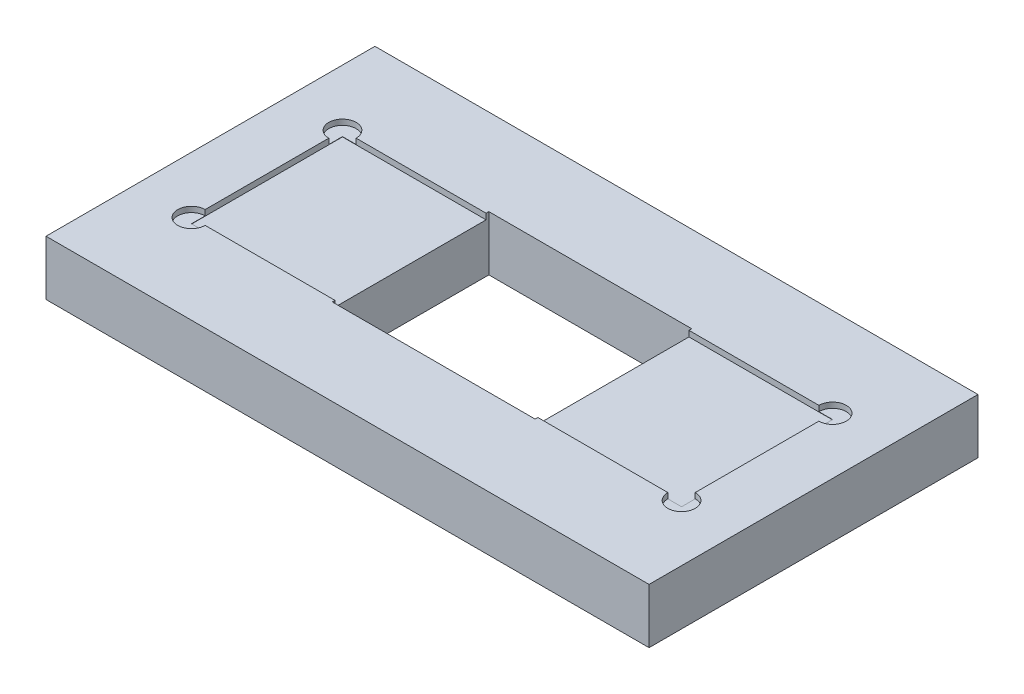
ISO-10303-21;
HEADER;
FILE_DESCRIPTION(('STEP AP214'),'2;1');
FILE_NAME('part.step','',(''),(''),'','','');
FILE_SCHEMA(('AUTOMOTIVE_DESIGN { 1 0 10303 214 1 1 1 1 }'));
ENDSEC;
DATA;
#1=APPLICATION_CONTEXT('core data for automotive mechanical design processes');
#2=APPLICATION_PROTOCOL_DEFINITION('international standard','automotive_design',2000,#1);
#3=PRODUCT_CONTEXT('',#1,'mechanical');
#4=PRODUCT('Part','Part','',(#3));
#5=PRODUCT_RELATED_PRODUCT_CATEGORY('part','',(#4));
#6=PRODUCT_DEFINITION_FORMATION('','',#4);
#7=PRODUCT_DEFINITION_CONTEXT('part definition',#1,'design');
#8=PRODUCT_DEFINITION('design','',#6,#7);
#9=PRODUCT_DEFINITION_SHAPE('','',#8);
#10=(LENGTH_UNIT() NAMED_UNIT(*) SI_UNIT(.MILLI.,.METRE.));
#11=(NAMED_UNIT(*) PLANE_ANGLE_UNIT() SI_UNIT($,.RADIAN.));
#12=(NAMED_UNIT(*) SI_UNIT($,.STERADIAN.) SOLID_ANGLE_UNIT());
#13=UNCERTAINTY_MEASURE_WITH_UNIT(LENGTH_MEASURE(1.E-05),#10,'distance_accuracy_value','');
#14=(GEOMETRIC_REPRESENTATION_CONTEXT(3) GLOBAL_UNCERTAINTY_ASSIGNED_CONTEXT((#13)) GLOBAL_UNIT_ASSIGNED_CONTEXT((#10,
#11,#12)) REPRESENTATION_CONTEXT('',''));
#15=CARTESIAN_POINT('',(0.,0.,0.));
#16=DIRECTION('',(0.,0.,1.));
#17=DIRECTION('',(1.,0.,0.));
#18=AXIS2_PLACEMENT_3D('',#15,#16,#17);
#19=CARTESIAN_POINT('',(-89.4,-2.1,27.55));
#20=DIRECTION('',(0.,0.,1.));
#21=DIRECTION('',(1.,0.,0.));
#22=AXIS2_PLACEMENT_3D('',#19,#20,#21);
#23=PLANE('',#22);
#24=DIRECTION('',(1.,0.,0.));
#25=VECTOR('',#24,1.);
#26=CARTESIAN_POINT('',(-89.4,0.,27.55));
#27=LINE('',#26,#25);
#28=CARTESIAN_POINT('',(-84.4,0.,27.55));
#29=VERTEX_POINT('',#28);
#30=CARTESIAN_POINT('',(-37.,0.,27.55));
#31=VERTEX_POINT('',#30);
#32=EDGE_CURVE('E299',#29,#31,#27,.T.);
#33=ORIENTED_EDGE('',*,*,#32,.T.);
#34=DIRECTION('',(0.,-1.,0.));
#35=VECTOR('',#34,1.);
#36=CARTESIAN_POINT('',(-37.,-2.1,27.55));
#37=LINE('',#36,#35);
#38=CARTESIAN_POINT('',(-37.,-2.1,27.55));
#39=VERTEX_POINT('',#38);
#40=EDGE_CURVE('E205',#31,#39,#37,.T.);
#41=ORIENTED_EDGE('',*,*,#40,.T.);
#42=DIRECTION('',(1.,0.,0.));
#43=VECTOR('',#42,1.);
#44=CARTESIAN_POINT('',(-89.4,-2.1,27.55));
#45=LINE('',#44,#43);
#46=CARTESIAN_POINT('',(-89.4,-2.1,27.55));
#47=VERTEX_POINT('',#46);
#48=EDGE_CURVE('E307',#47,#39,#45,.T.);
#49=ORIENTED_EDGE('',*,*,#48,.F.);
#50=DIRECTION('',(0.,1.,0.));
#51=VECTOR('',#50,1.);
#52=CARTESIAN_POINT('',(-89.4,-2.1,27.55));
#53=LINE('',#52,#51);
#54=CARTESIAN_POINT('',(-89.4,-2.,27.55));
#55=VERTEX_POINT('',#54);
#56=EDGE_CURVE('E326',#47,#55,#53,.T.);
#57=ORIENTED_EDGE('',*,*,#56,.T.);
#58=DIRECTION('',(-1.,0.,0.));
#59=VECTOR('',#58,1.);
#60=CARTESIAN_POINT('',(-89.4,-2.,27.55));
#61=LINE('',#60,#59);
#62=CARTESIAN_POINT('',(-84.4,-2.,27.55));
#63=VERTEX_POINT('',#62);
#64=EDGE_CURVE('E284',#63,#55,#61,.T.);
#65=ORIENTED_EDGE('',*,*,#64,.F.);
#66=DIRECTION('',(0.,1.,0.));
#67=VECTOR('',#66,1.);
#68=CARTESIAN_POINT('',(-84.4,-2.,27.55));
#69=LINE('',#68,#67);
#70=EDGE_CURVE('E286',#63,#29,#69,.T.);
#71=ORIENTED_EDGE('',*,*,#70,.T.);
#72=EDGE_LOOP('',(#33,#41,#49,#57,#65,#71));
#73=FACE_BOUND('',#72,.T.);
#74=ADVANCED_FACE('F39',(#73),#23,.F.);
#75=CARTESIAN_POINT('',(-89.4,-2.1,-27.55));
#76=DIRECTION('',(0.,0.,-1.));
#77=DIRECTION('',(-1.,0.,0.));
#78=AXIS2_PLACEMENT_3D('',#75,#76,#77);
#79=PLANE('',#78);
#80=DIRECTION('',(-1.,0.,0.));
#81=VECTOR('',#80,1.);
#82=CARTESIAN_POINT('',(-89.4,-2.1,-27.55));
#83=LINE('',#82,#81);
#84=CARTESIAN_POINT('',(-37.,-2.1,-27.55));
#85=VERTEX_POINT('',#84);
#86=CARTESIAN_POINT('',(-89.4,-2.1,-27.55));
#87=VERTEX_POINT('',#86);
#88=EDGE_CURVE('E298',#85,#87,#83,.T.);
#89=ORIENTED_EDGE('',*,*,#88,.F.);
#90=DIRECTION('',(0.,1.,0.));
#91=VECTOR('',#90,1.);
#92=CARTESIAN_POINT('',(-37.,-2.1,-27.55));
#93=LINE('',#92,#91);
#94=CARTESIAN_POINT('',(-37.,0.,-27.55));
#95=VERTEX_POINT('',#94);
#96=EDGE_CURVE('E251',#85,#95,#93,.T.);
#97=ORIENTED_EDGE('',*,*,#96,.T.);
#98=DIRECTION('',(-1.,0.,0.));
#99=VECTOR('',#98,1.);
#100=CARTESIAN_POINT('',(-89.4,0.,-27.55));
#101=LINE('',#100,#99);
#102=CARTESIAN_POINT('',(-84.4,0.,-27.55));
#103=VERTEX_POINT('',#102);
#104=EDGE_CURVE('E313',#95,#103,#101,.T.);
#105=ORIENTED_EDGE('',*,*,#104,.T.);
#106=DIRECTION('',(0.,1.,0.));
#107=VECTOR('',#106,1.);
#108=CARTESIAN_POINT('',(-84.4,-2.,-27.55));
#109=LINE('',#108,#107);
#110=CARTESIAN_POINT('',(-84.4,-2.,-27.55));
#111=VERTEX_POINT('',#110);
#112=EDGE_CURVE('E367',#103,#111,#109,.F.);
#113=ORIENTED_EDGE('',*,*,#112,.T.);
#114=DIRECTION('',(1.,0.,0.));
#115=VECTOR('',#114,1.);
#116=CARTESIAN_POINT('',(-89.4,-2.,-27.55));
#117=LINE('',#116,#115);
#118=CARTESIAN_POINT('',(-89.4,-2.,-27.55));
#119=VERTEX_POINT('',#118);
#120=EDGE_CURVE('E360',#119,#111,#117,.T.);
#121=ORIENTED_EDGE('',*,*,#120,.F.);
#122=DIRECTION('',(0.,1.,0.));
#123=VECTOR('',#122,1.);
#124=CARTESIAN_POINT('',(-89.4,-2.1,-27.55));
#125=LINE('',#124,#123);
#126=EDGE_CURVE('E329',#87,#119,#125,.T.);
#127=ORIENTED_EDGE('',*,*,#126,.F.);
#128=EDGE_LOOP('',(#89,#97,#105,#113,#121,#127));
#129=FACE_BOUND('',#128,.T.);
#130=ADVANCED_FACE('F414',(#129),#79,.F.);
#131=CARTESIAN_POINT('',(0.,-2.1,0.));
#132=DIRECTION('',(0.,-1.,0.));
#133=DIRECTION('',(0.,0.,-1.));
#134=AXIS2_PLACEMENT_3D('',#131,#132,#133);
#135=PLANE('',#134);
#136=ORIENTED_EDGE('',*,*,#48,.T.);
#137=DIRECTION('',(0.,0.,-1.));
#138=VECTOR('',#137,1.);
#139=CARTESIAN_POINT('',(-37.,-2.1,0.));
#140=LINE('',#139,#138);
#141=EDGE_CURVE('E11',#39,#85,#140,.T.);
#142=ORIENTED_EDGE('',*,*,#141,.T.);
#143=ORIENTED_EDGE('',*,*,#88,.T.);
#144=DIRECTION('',(0.,0.,1.));
#145=VECTOR('',#144,1.);
#146=CARTESIAN_POINT('',(-89.4,-2.1,27.55));
#147=LINE('',#146,#145);
#148=EDGE_CURVE('E303',#87,#47,#147,.T.);
#149=ORIENTED_EDGE('',*,*,#148,.T.);
#150=EDGE_LOOP('',(#136,#142,#143,#149));
#151=FACE_BOUND('',#150,.T.);
#152=ADVANCED_FACE('F433',(#151),#135,.F.);
#153=CARTESIAN_POINT('',(110.,-20.,60.));
#154=DIRECTION('',(1.,0.,0.));
#155=DIRECTION('',(0.,0.,-1.));
#156=AXIS2_PLACEMENT_3D('',#153,#154,#155);
#157=PLANE('',#156);
#158=DIRECTION('',(0.,0.,-1.));
#159=VECTOR('',#158,1.);
#160=CARTESIAN_POINT('',(110.,0.,60.));
#161=LINE('',#160,#159);
#162=CARTESIAN_POINT('',(110.,0.,60.));
#163=VERTEX_POINT('',#162);
#164=CARTESIAN_POINT('',(110.,0.,-60.));
#165=VERTEX_POINT('',#164);
#166=EDGE_CURVE('E325',#163,#165,#161,.T.);
#167=ORIENTED_EDGE('',*,*,#166,.F.);
#168=DIRECTION('',(0.,1.,0.));
#169=VECTOR('',#168,1.);
#170=CARTESIAN_POINT('',(110.,-20.,60.));
#171=LINE('',#170,#169);
#172=CARTESIAN_POINT('',(110.,-20.,60.));
#173=VERTEX_POINT('',#172);
#174=EDGE_CURVE('E358',#173,#163,#171,.T.);
#175=ORIENTED_EDGE('',*,*,#174,.F.);
#176=DIRECTION('',(0.,0.,-1.));
#177=VECTOR('',#176,1.);
#178=CARTESIAN_POINT('',(110.,-20.,60.));
#179=LINE('',#178,#177);
#180=CARTESIAN_POINT('',(110.,-20.,-60.));
#181=VERTEX_POINT('',#180);
#182=EDGE_CURVE('E334',#173,#181,#179,.T.);
#183=ORIENTED_EDGE('',*,*,#182,.T.);
#184=DIRECTION('',(0.,1.,0.));
#185=VECTOR('',#184,1.);
#186=CARTESIAN_POINT('',(110.,-20.,-60.));
#187=LINE('',#186,#185);
#188=EDGE_CURVE('E347',#181,#165,#187,.T.);
#189=ORIENTED_EDGE('',*,*,#188,.T.);
#190=EDGE_LOOP('',(#167,#175,#183,#189));
#191=FACE_BOUND('',#190,.T.);
#192=ADVANCED_FACE('F41',(#191),#157,.T.);
#193=CARTESIAN_POINT('',(-110.,-20.,60.));
#194=DIRECTION('',(0.,0.,1.));
#195=DIRECTION('',(1.,0.,0.));
#196=AXIS2_PLACEMENT_3D('',#193,#194,#195);
#197=PLANE('',#196);
#198=DIRECTION('',(1.,0.,0.));
#199=VECTOR('',#198,1.);
#200=CARTESIAN_POINT('',(-110.,0.,60.));
#201=LINE('',#200,#199);
#202=CARTESIAN_POINT('',(-110.,0.,60.));
#203=VERTEX_POINT('',#202);
#204=EDGE_CURVE('E338',#203,#163,#201,.T.);
#205=ORIENTED_EDGE('',*,*,#204,.F.);
#206=DIRECTION('',(0.,1.,0.));
#207=VECTOR('',#206,1.);
#208=CARTESIAN_POINT('',(-110.,-20.,60.));
#209=LINE('',#208,#207);
#210=CARTESIAN_POINT('',(-110.,-20.,60.));
#211=VERTEX_POINT('',#210);
#212=EDGE_CURVE('E361',#211,#203,#209,.T.);
#213=ORIENTED_EDGE('',*,*,#212,.F.);
#214=DIRECTION('',(1.,0.,0.));
#215=VECTOR('',#214,1.);
#216=CARTESIAN_POINT('',(-110.,-20.,60.));
#217=LINE('',#216,#215);
#218=EDGE_CURVE('E344',#211,#173,#217,.T.);
#219=ORIENTED_EDGE('',*,*,#218,.T.);
#220=ORIENTED_EDGE('',*,*,#174,.T.);
#221=EDGE_LOOP('',(#205,#213,#219,#220));
#222=FACE_BOUND('',#221,.T.);
#223=ADVANCED_FACE('F479',(#222),#197,.T.);
#224=CARTESIAN_POINT('',(-110.,-20.,60.));
#225=DIRECTION('',(-1.,0.,0.));
#226=DIRECTION('',(0.,0.,1.));
#227=AXIS2_PLACEMENT_3D('',#224,#225,#226);
#228=PLANE('',#227);
#229=DIRECTION('',(0.,0.,1.));
#230=VECTOR('',#229,1.);
#231=CARTESIAN_POINT('',(-110.,0.,60.));
#232=LINE('',#231,#230);
#233=CARTESIAN_POINT('',(-110.,0.,-60.));
#234=VERTEX_POINT('',#233);
#235=EDGE_CURVE('E353',#234,#203,#232,.T.);
#236=ORIENTED_EDGE('',*,*,#235,.F.);
#237=DIRECTION('',(0.,1.,0.));
#238=VECTOR('',#237,1.);
#239=CARTESIAN_POINT('',(-110.,-20.,-60.));
#240=LINE('',#239,#238);
#241=CARTESIAN_POINT('',(-110.,-20.,-60.));
#242=VERTEX_POINT('',#241);
#243=EDGE_CURVE('E363',#242,#234,#240,.T.);
#244=ORIENTED_EDGE('',*,*,#243,.F.);
#245=DIRECTION('',(0.,0.,1.));
#246=VECTOR('',#245,1.);
#247=CARTESIAN_POINT('',(-110.,-20.,60.));
#248=LINE('',#247,#246);
#249=EDGE_CURVE('E341',#242,#211,#248,.T.);
#250=ORIENTED_EDGE('',*,*,#249,.T.);
#251=ORIENTED_EDGE('',*,*,#212,.T.);
#252=EDGE_LOOP('',(#236,#244,#250,#251));
#253=FACE_BOUND('',#252,.T.);
#254=ADVANCED_FACE('F482',(#253),#228,.T.);
#255=CARTESIAN_POINT('',(-110.,-20.,-60.));
#256=DIRECTION('',(0.,0.,-1.));
#257=DIRECTION('',(-1.,0.,0.));
#258=AXIS2_PLACEMENT_3D('',#255,#256,#257);
#259=PLANE('',#258);
#260=DIRECTION('',(-1.,0.,0.));
#261=VECTOR('',#260,1.);
#262=CARTESIAN_POINT('',(-110.,0.,-60.));
#263=LINE('',#262,#261);
#264=EDGE_CURVE('E350',#165,#234,#263,.T.);
#265=ORIENTED_EDGE('',*,*,#264,.F.);
#266=ORIENTED_EDGE('',*,*,#188,.F.);
#267=DIRECTION('',(-1.,0.,0.));
#268=VECTOR('',#267,1.);
#269=CARTESIAN_POINT('',(-110.,-20.,-60.));
#270=LINE('',#269,#268);
#271=EDGE_CURVE('E337',#181,#242,#270,.T.);
#272=ORIENTED_EDGE('',*,*,#271,.T.);
#273=ORIENTED_EDGE('',*,*,#243,.T.);
#274=EDGE_LOOP('',(#265,#266,#272,#273));
#275=FACE_BOUND('',#274,.T.);
#276=ADVANCED_FACE('F477',(#275),#259,.T.);
#277=CARTESIAN_POINT('',(0.,-20.,0.));
#278=DIRECTION('',(0.,-1.,0.));
#279=DIRECTION('',(0.,0.,-1.));
#280=AXIS2_PLACEMENT_3D('',#277,#278,#279);
#281=PLANE('',#280);
#282=DIRECTION('',(0.,0.,1.));
#283=VECTOR('',#282,1.);
#284=CARTESIAN_POINT('',(-37.,-20.,28.55));
#285=LINE('',#284,#283);
#286=CARTESIAN_POINT('',(-37.,-20.,-28.55));
#287=VERTEX_POINT('',#286);
#288=CARTESIAN_POINT('',(-37.,-20.,28.55));
#289=VERTEX_POINT('',#288);
#290=EDGE_CURVE('E235',#287,#289,#285,.T.);
#291=ORIENTED_EDGE('',*,*,#290,.T.);
#292=DIRECTION('',(1.,0.,0.));
#293=VECTOR('',#292,1.);
#294=CARTESIAN_POINT('',(-37.,-20.,28.55));
#295=LINE('',#294,#293);
#296=CARTESIAN_POINT('',(37.,-20.,28.55));
#297=VERTEX_POINT('',#296);
#298=EDGE_CURVE('E218',#289,#297,#295,.T.);
#299=ORIENTED_EDGE('',*,*,#298,.T.);
#300=DIRECTION('',(0.,0.,-1.));
#301=VECTOR('',#300,1.);
#302=CARTESIAN_POINT('',(37.,-20.,28.55));
#303=LINE('',#302,#301);
#304=CARTESIAN_POINT('',(37.,-20.,-28.55));
#305=VERTEX_POINT('',#304);
#306=EDGE_CURVE('E54',#297,#305,#303,.T.);
#307=ORIENTED_EDGE('',*,*,#306,.T.);
#308=DIRECTION('',(-1.,0.,0.));
#309=VECTOR('',#308,1.);
#310=CARTESIAN_POINT('',(-37.,-20.,-28.55));
#311=LINE('',#310,#309);
#312=EDGE_CURVE('E221',#305,#287,#311,.T.);
#313=ORIENTED_EDGE('',*,*,#312,.T.);
#314=EDGE_LOOP('',(#291,#299,#307,#313));
#315=FACE_BOUND('',#314,.T.);
#316=ORIENTED_EDGE('',*,*,#182,.F.);
#317=ORIENTED_EDGE('',*,*,#218,.F.);
#318=ORIENTED_EDGE('',*,*,#249,.F.);
#319=ORIENTED_EDGE('',*,*,#271,.F.);
#320=EDGE_LOOP('',(#316,#317,#318,#319));
#321=FACE_BOUND('',#320,.T.);
#322=ADVANCED_FACE('F410',(#315,#321),#281,.T.);
#323=CARTESIAN_POINT('',(0.,0.,0.));
#324=DIRECTION('',(0.,-1.,0.));
#325=DIRECTION('',(0.,0.,-1.));
#326=AXIS2_PLACEMENT_3D('',#323,#324,#325);
#327=PLANE('',#326);
#328=ORIENTED_EDGE('',*,*,#104,.F.);
#329=DIRECTION('',(0.,0.,1.));
#330=VECTOR('',#329,1.);
#331=CARTESIAN_POINT('',(-37.,0.,28.55));
#332=LINE('',#331,#330);
#333=CARTESIAN_POINT('',(-37.,0.,-28.55));
#334=VERTEX_POINT('',#333);
#335=EDGE_CURVE('E210',#334,#95,#332,.T.);
#336=ORIENTED_EDGE('',*,*,#335,.F.);
#337=DIRECTION('',(-1.,0.,0.));
#338=VECTOR('',#337,1.);
#339=CARTESIAN_POINT('',(-37.,0.,-28.55));
#340=LINE('',#339,#338);
#341=CARTESIAN_POINT('',(37.,0.,-28.55));
#342=VERTEX_POINT('',#341);
#343=EDGE_CURVE('E232',#342,#334,#340,.T.);
#344=ORIENTED_EDGE('',*,*,#343,.F.);
#345=DIRECTION('',(0.,0.,-1.));
#346=VECTOR('',#345,1.);
#347=CARTESIAN_POINT('',(37.,0.,28.55));
#348=LINE('',#347,#346);
#349=CARTESIAN_POINT('',(37.,0.,-27.55));
#350=VERTEX_POINT('',#349);
#351=EDGE_CURVE('E228',#350,#342,#348,.T.);
#352=ORIENTED_EDGE('',*,*,#351,.F.);
#353=CARTESIAN_POINT('',(84.4,0.,-27.55));
#354=VERTEX_POINT('',#353);
#355=EDGE_CURVE('E314',#354,#350,#101,.T.);
#356=ORIENTED_EDGE('',*,*,#355,.F.);
#357=CARTESIAN_POINT('',(89.4,0.,-27.55));
#358=DIRECTION('',(0.,1.,0.));
#359=DIRECTION('',(0.,0.,1.));
#360=AXIS2_PLACEMENT_3D('',#357,#358,#359);
#361=CIRCLE('',#360,5.);
#362=CARTESIAN_POINT('',(89.4,0.,-22.55));
#363=VERTEX_POINT('',#362);
#364=EDGE_CURVE('E256',#363,#354,#361,.T.);
#365=ORIENTED_EDGE('',*,*,#364,.F.);
#366=DIRECTION('',(0.,0.,-1.));
#367=VECTOR('',#366,1.);
#368=CARTESIAN_POINT('',(89.4,0.,27.55));
#369=LINE('',#368,#367);
#370=CARTESIAN_POINT('',(89.4,0.,22.55));
#371=VERTEX_POINT('',#370);
#372=EDGE_CURVE('E294',#371,#363,#369,.T.);
#373=ORIENTED_EDGE('',*,*,#372,.F.);
#374=CARTESIAN_POINT('',(89.4,0.,27.55));
#375=DIRECTION('',(0.,1.,0.));
#376=DIRECTION('',(0.,0.,1.));
#377=AXIS2_PLACEMENT_3D('',#374,#375,#376);
#378=CIRCLE('',#377,5.);
#379=CARTESIAN_POINT('',(84.4,0.,27.55));
#380=VERTEX_POINT('',#379);
#381=EDGE_CURVE('E261',#380,#371,#378,.T.);
#382=ORIENTED_EDGE('',*,*,#381,.F.);
#383=CARTESIAN_POINT('',(37.,0.,27.55));
#384=VERTEX_POINT('',#383);
#385=EDGE_CURVE('E320',#384,#380,#27,.T.);
#386=ORIENTED_EDGE('',*,*,#385,.F.);
#387=CARTESIAN_POINT('',(37.,0.,28.55));
#388=VERTEX_POINT('',#387);
#389=EDGE_CURVE('E227',#388,#384,#348,.T.);
#390=ORIENTED_EDGE('',*,*,#389,.F.);
#391=DIRECTION('',(1.,0.,0.));
#392=VECTOR('',#391,1.);
#393=CARTESIAN_POINT('',(-37.,0.,28.55));
#394=LINE('',#393,#392);
#395=CARTESIAN_POINT('',(-37.,0.,28.55));
#396=VERTEX_POINT('',#395);
#397=EDGE_CURVE('E215',#396,#388,#394,.T.);
#398=ORIENTED_EDGE('',*,*,#397,.F.);
#399=EDGE_CURVE('E198',#31,#396,#332,.T.);
#400=ORIENTED_EDGE('',*,*,#399,.F.);
#401=ORIENTED_EDGE('',*,*,#32,.F.);
#402=CARTESIAN_POINT('',(-89.4,0.,27.55));
#403=DIRECTION('',(0.,1.,0.));
#404=DIRECTION('',(0.,0.,1.));
#405=AXIS2_PLACEMENT_3D('',#402,#403,#404);
#406=CIRCLE('',#405,5.);
#407=CARTESIAN_POINT('',(-89.4,0.,22.55));
#408=VERTEX_POINT('',#407);
#409=EDGE_CURVE('E266',#408,#29,#406,.T.);
#410=ORIENTED_EDGE('',*,*,#409,.F.);
#411=DIRECTION('',(0.,0.,1.));
#412=VECTOR('',#411,1.);
#413=CARTESIAN_POINT('',(-89.4,0.,27.55));
#414=LINE('',#413,#412);
#415=CARTESIAN_POINT('',(-89.4,0.,-22.55));
#416=VERTEX_POINT('',#415);
#417=EDGE_CURVE('E317',#416,#408,#414,.T.);
#418=ORIENTED_EDGE('',*,*,#417,.F.);
#419=CARTESIAN_POINT('',(-89.4,0.,-27.55));
#420=DIRECTION('',(0.,1.,0.));
#421=DIRECTION('',(0.,0.,1.));
#422=AXIS2_PLACEMENT_3D('',#419,#420,#421);
#423=CIRCLE('',#422,5.);
#424=EDGE_CURVE('E258',#103,#416,#423,.T.);
#425=ORIENTED_EDGE('',*,*,#424,.F.);
#426=EDGE_LOOP('',(#328,#336,#344,#352,#356,#365,#373,#382,#386,#390,#398,#400,#401,#410,#418,#425));
#427=FACE_BOUND('',#426,.T.);
#428=ORIENTED_EDGE('',*,*,#166,.T.);
#429=ORIENTED_EDGE('',*,*,#264,.T.);
#430=ORIENTED_EDGE('',*,*,#235,.T.);
#431=ORIENTED_EDGE('',*,*,#204,.T.);
#432=EDGE_LOOP('',(#428,#429,#430,#431));
#433=FACE_BOUND('',#432,.T.);
#434=ADVANCED_FACE('F224',(#427,#433),#327,.F.);
#435=CARTESIAN_POINT('',(89.4,-2.1,27.55));
#436=DIRECTION('',(1.,0.,0.));
#437=DIRECTION('',(0.,0.,-1.));
#438=AXIS2_PLACEMENT_3D('',#435,#436,#437);
#439=PLANE('',#438);
#440=DIRECTION('',(0.,0.,1.));
#441=VECTOR('',#440,1.);
#442=CARTESIAN_POINT('',(89.4,-2.,27.55));
#443=LINE('',#442,#441);
#444=CARTESIAN_POINT('',(89.4,-2.,22.55));
#445=VERTEX_POINT('',#444);
#446=CARTESIAN_POINT('',(89.4,-2.,27.55));
#447=VERTEX_POINT('',#446);
#448=EDGE_CURVE('E289',#445,#447,#443,.T.);
#449=ORIENTED_EDGE('',*,*,#448,.F.);
#450=DIRECTION('',(0.,1.,0.));
#451=VECTOR('',#450,1.);
#452=CARTESIAN_POINT('',(89.4,-2.,22.55));
#453=LINE('',#452,#451);
#454=EDGE_CURVE('E291',#445,#371,#453,.T.);
#455=ORIENTED_EDGE('',*,*,#454,.T.);
#456=ORIENTED_EDGE('',*,*,#372,.T.);
#457=DIRECTION('',(0.,1.,0.));
#458=VECTOR('',#457,1.);
#459=CARTESIAN_POINT('',(89.4,-2.,-22.55));
#460=LINE('',#459,#458);
#461=CARTESIAN_POINT('',(89.4,-2.,-22.55));
#462=VERTEX_POINT('',#461);
#463=EDGE_CURVE('E281',#363,#462,#460,.F.);
#464=ORIENTED_EDGE('',*,*,#463,.T.);
#465=DIRECTION('',(0.,0.,1.));
#466=VECTOR('',#465,1.);
#467=CARTESIAN_POINT('',(89.4,-2.,27.55));
#468=LINE('',#467,#466);
#469=CARTESIAN_POINT('',(89.4,-2.,-27.55));
#470=VERTEX_POINT('',#469);
#471=EDGE_CURVE('E279',#470,#462,#468,.T.);
#472=ORIENTED_EDGE('',*,*,#471,.F.);
#473=DIRECTION('',(0.,1.,0.));
#474=VECTOR('',#473,1.);
#475=CARTESIAN_POINT('',(89.4,-2.1,-27.55));
#476=LINE('',#475,#474);
#477=CARTESIAN_POINT('',(89.4,-2.1,-27.55));
#478=VERTEX_POINT('',#477);
#479=EDGE_CURVE('E310',#478,#470,#476,.T.);
#480=ORIENTED_EDGE('',*,*,#479,.F.);
#481=DIRECTION('',(0.,0.,-1.));
#482=VECTOR('',#481,1.);
#483=CARTESIAN_POINT('',(89.4,-2.1,27.55));
#484=LINE('',#483,#482);
#485=CARTESIAN_POINT('',(89.4,-2.1,27.55));
#486=VERTEX_POINT('',#485);
#487=EDGE_CURVE('E295',#486,#478,#484,.T.);
#488=ORIENTED_EDGE('',*,*,#487,.F.);
#489=DIRECTION('',(0.,1.,0.));
#490=VECTOR('',#489,1.);
#491=CARTESIAN_POINT('',(89.4,-2.1,27.55));
#492=LINE('',#491,#490);
#493=EDGE_CURVE('E322',#486,#447,#492,.T.);
#494=ORIENTED_EDGE('',*,*,#493,.T.);
#495=EDGE_LOOP('',(#449,#455,#456,#464,#472,#480,#488,#494));
#496=FACE_BOUND('',#495,.T.);
#497=ADVANCED_FACE('F395',(#496),#439,.F.);
#498=CARTESIAN_POINT('',(36.9999999999999,-2.1,27.55));
#499=VERTEX_POINT('',#498);
#500=EDGE_CURVE('E306',#499,#486,#45,.T.);
#501=ORIENTED_EDGE('',*,*,#500,.F.);
#502=DIRECTION('',(0.,1.,0.));
#503=VECTOR('',#502,1.);
#504=CARTESIAN_POINT('',(37.,-2.1,27.55));
#505=LINE('',#504,#503);
#506=EDGE_CURVE('E61',#499,#384,#505,.T.);
#507=ORIENTED_EDGE('',*,*,#506,.T.);
#508=ORIENTED_EDGE('',*,*,#385,.T.);
#509=DIRECTION('',(0.,1.,0.));
#510=VECTOR('',#509,1.);
#511=CARTESIAN_POINT('',(84.4,-2.,27.55));
#512=LINE('',#511,#510);
#513=CARTESIAN_POINT('',(84.4,-2.,27.55));
#514=VERTEX_POINT('',#513);
#515=EDGE_CURVE('E382',#380,#514,#512,.F.);
#516=ORIENTED_EDGE('',*,*,#515,.T.);
#517=DIRECTION('',(-1.,0.,0.));
#518=VECTOR('',#517,1.);
#519=CARTESIAN_POINT('',(-89.4,-2.,27.55));
#520=LINE('',#519,#518);
#521=EDGE_CURVE('E380',#447,#514,#520,.T.);
#522=ORIENTED_EDGE('',*,*,#521,.F.);
#523=ORIENTED_EDGE('',*,*,#493,.F.);
#524=EDGE_LOOP('',(#501,#507,#508,#516,#522,#523));
#525=FACE_BOUND('',#524,.T.);
#526=ADVANCED_FACE('F390',(#525),#23,.F.);
#527=CARTESIAN_POINT('',(-89.4,-2.1,27.55));
#528=DIRECTION('',(-1.,0.,0.));
#529=DIRECTION('',(0.,0.,1.));
#530=AXIS2_PLACEMENT_3D('',#527,#528,#529);
#531=PLANE('',#530);
#532=ORIENTED_EDGE('',*,*,#417,.T.);
#533=DIRECTION('',(0.,1.,0.));
#534=VECTOR('',#533,1.);
#535=CARTESIAN_POINT('',(-89.4,-2.,22.55));
#536=LINE('',#535,#534);
#537=CARTESIAN_POINT('',(-89.4,-2.,22.55));
#538=VERTEX_POINT('',#537);
#539=EDGE_CURVE('E377',#408,#538,#536,.F.);
#540=ORIENTED_EDGE('',*,*,#539,.T.);
#541=DIRECTION('',(0.,0.,-1.));
#542=VECTOR('',#541,1.);
#543=CARTESIAN_POINT('',(-89.4,-2.,27.55));
#544=LINE('',#543,#542);
#545=EDGE_CURVE('E375',#55,#538,#544,.T.);
#546=ORIENTED_EDGE('',*,*,#545,.F.);
#547=ORIENTED_EDGE('',*,*,#56,.F.);
#548=ORIENTED_EDGE('',*,*,#148,.F.);
#549=ORIENTED_EDGE('',*,*,#126,.T.);
#550=DIRECTION('',(0.,0.,-1.));
#551=VECTOR('',#550,1.);
#552=CARTESIAN_POINT('',(-89.4,-2.,27.55));
#553=LINE('',#552,#551);
#554=CARTESIAN_POINT('',(-89.4,-2.,-22.55));
#555=VERTEX_POINT('',#554);
#556=EDGE_CURVE('E273',#555,#119,#553,.T.);
#557=ORIENTED_EDGE('',*,*,#556,.F.);
#558=DIRECTION('',(0.,1.,0.));
#559=VECTOR('',#558,1.);
#560=CARTESIAN_POINT('',(-89.4,-2.,-22.55));
#561=LINE('',#560,#559);
#562=EDGE_CURVE('E276',#555,#416,#561,.T.);
#563=ORIENTED_EDGE('',*,*,#562,.T.);
#564=EDGE_LOOP('',(#532,#540,#546,#547,#548,#549,#557,#563));
#565=FACE_BOUND('',#564,.T.);
#566=ADVANCED_FACE('F425',(#565),#531,.F.);
#567=ORIENTED_EDGE('',*,*,#355,.T.);
#568=DIRECTION('',(0.,-1.,0.));
#569=VECTOR('',#568,1.);
#570=CARTESIAN_POINT('',(37.,-2.1,-27.55));
#571=LINE('',#570,#569);
#572=CARTESIAN_POINT('',(37.,-2.1,-27.55));
#573=VERTEX_POINT('',#572);
#574=EDGE_CURVE('E243',#350,#573,#571,.T.);
#575=ORIENTED_EDGE('',*,*,#574,.T.);
#576=EDGE_CURVE('E300',#478,#573,#83,.T.);
#577=ORIENTED_EDGE('',*,*,#576,.F.);
#578=ORIENTED_EDGE('',*,*,#479,.T.);
#579=DIRECTION('',(1.,0.,0.));
#580=VECTOR('',#579,1.);
#581=CARTESIAN_POINT('',(-89.4,-2.,-27.55));
#582=LINE('',#581,#580);
#583=CARTESIAN_POINT('',(84.4,-2.,-27.55));
#584=VERTEX_POINT('',#583);
#585=EDGE_CURVE('E370',#584,#470,#582,.T.);
#586=ORIENTED_EDGE('',*,*,#585,.F.);
#587=DIRECTION('',(0.,1.,0.));
#588=VECTOR('',#587,1.);
#589=CARTESIAN_POINT('',(84.4,-2.,-27.55));
#590=LINE('',#589,#588);
#591=EDGE_CURVE('E372',#584,#354,#590,.T.);
#592=ORIENTED_EDGE('',*,*,#591,.T.);
#593=EDGE_LOOP('',(#567,#575,#577,#578,#586,#592));
#594=FACE_BOUND('',#593,.T.);
#595=ADVANCED_FACE('F399',(#594),#79,.F.);
#596=ORIENTED_EDGE('',*,*,#576,.T.);
#597=DIRECTION('',(0.,0.,1.));
#598=VECTOR('',#597,1.);
#599=CARTESIAN_POINT('',(37.,-2.1,0.));
#600=LINE('',#599,#598);
#601=EDGE_CURVE('E47',#573,#499,#600,.T.);
#602=ORIENTED_EDGE('',*,*,#601,.T.);
#603=ORIENTED_EDGE('',*,*,#500,.T.);
#604=ORIENTED_EDGE('',*,*,#487,.T.);
#605=EDGE_LOOP('',(#596,#602,#603,#604));
#606=FACE_BOUND('',#605,.T.);
#607=ADVANCED_FACE('F386',(#606),#135,.F.);
#608=CARTESIAN_POINT('',(-89.4,-2.,-27.55));
#609=DIRECTION('',(0.,1.,0.));
#610=DIRECTION('',(0.,0.,1.));
#611=AXIS2_PLACEMENT_3D('',#608,#609,#610);
#612=CYLINDRICAL_SURFACE('',#611,5.);
#613=CARTESIAN_POINT('',(-89.4,-2.,-27.55));
#614=DIRECTION('',(0.,1.,0.));
#615=DIRECTION('',(0.,0.,1.));
#616=AXIS2_PLACEMENT_3D('',#613,#614,#615);
#617=CIRCLE('',#616,5.);
#618=EDGE_CURVE('E270',#111,#555,#617,.T.);
#619=ORIENTED_EDGE('',*,*,#618,.F.);
#620=ORIENTED_EDGE('',*,*,#112,.F.);
#621=ORIENTED_EDGE('',*,*,#424,.T.);
#622=ORIENTED_EDGE('',*,*,#562,.F.);
#623=EDGE_LOOP('',(#619,#620,#621,#622));
#624=FACE_BOUND('',#623,.T.);
#625=ADVANCED_FACE('F422',(#624),#612,.F.);
#626=CARTESIAN_POINT('',(-89.4,-2.,-27.55));
#627=DIRECTION('',(0.,1.,0.));
#628=DIRECTION('',(0.,0.,1.));
#629=AXIS2_PLACEMENT_3D('',#626,#627,#628);
#630=PLANE('',#629);
#631=ORIENTED_EDGE('',*,*,#556,.T.);
#632=ORIENTED_EDGE('',*,*,#120,.T.);
#633=ORIENTED_EDGE('',*,*,#618,.T.);
#634=EDGE_LOOP('',(#631,#632,#633));
#635=FACE_BOUND('',#634,.T.);
#636=ADVANCED_FACE('F429',(#635),#630,.T.);
#637=CARTESIAN_POINT('',(89.4,-2.,-27.55));
#638=DIRECTION('',(0.,1.,0.));
#639=DIRECTION('',(0.,0.,1.));
#640=AXIS2_PLACEMENT_3D('',#637,#638,#639);
#641=CYLINDRICAL_SURFACE('',#640,5.);
#642=ORIENTED_EDGE('',*,*,#364,.T.);
#643=ORIENTED_EDGE('',*,*,#591,.F.);
#644=CARTESIAN_POINT('',(89.4,-2.,-27.55));
#645=DIRECTION('',(0.,1.,0.));
#646=DIRECTION('',(0.,0.,1.));
#647=AXIS2_PLACEMENT_3D('',#644,#645,#646);
#648=CIRCLE('',#647,5.);
#649=EDGE_CURVE('E259',#462,#584,#648,.T.);
#650=ORIENTED_EDGE('',*,*,#649,.F.);
#651=ORIENTED_EDGE('',*,*,#463,.F.);
#652=EDGE_LOOP('',(#642,#643,#650,#651));
#653=FACE_BOUND('',#652,.T.);
#654=ADVANCED_FACE('F536',(#653),#641,.F.);
#655=CARTESIAN_POINT('',(89.4,-2.,-27.55));
#656=DIRECTION('',(0.,1.,0.));
#657=DIRECTION('',(0.,0.,1.));
#658=AXIS2_PLACEMENT_3D('',#655,#656,#657);
#659=PLANE('',#658);
#660=ORIENTED_EDGE('',*,*,#471,.T.);
#661=ORIENTED_EDGE('',*,*,#649,.T.);
#662=ORIENTED_EDGE('',*,*,#585,.T.);
#663=EDGE_LOOP('',(#660,#661,#662));
#664=FACE_BOUND('',#663,.T.);
#665=ADVANCED_FACE('F451',(#664),#659,.T.);
#666=CARTESIAN_POINT('',(-89.4,-2.,27.55));
#667=DIRECTION('',(0.,1.,0.));
#668=DIRECTION('',(0.,0.,1.));
#669=AXIS2_PLACEMENT_3D('',#666,#667,#668);
#670=CYLINDRICAL_SURFACE('',#669,5.);
#671=CARTESIAN_POINT('',(-89.4,-2.,27.55));
#672=DIRECTION('',(0.,1.,0.));
#673=DIRECTION('',(0.,0.,1.));
#674=AXIS2_PLACEMENT_3D('',#671,#672,#673);
#675=CIRCLE('',#674,5.);
#676=EDGE_CURVE('E255',#538,#63,#675,.T.);
#677=ORIENTED_EDGE('',*,*,#676,.F.);
#678=ORIENTED_EDGE('',*,*,#539,.F.);
#679=ORIENTED_EDGE('',*,*,#409,.T.);
#680=ORIENTED_EDGE('',*,*,#70,.F.);
#681=EDGE_LOOP('',(#677,#678,#679,#680));
#682=FACE_BOUND('',#681,.T.);
#683=ADVANCED_FACE('F438',(#682),#670,.F.);
#684=CARTESIAN_POINT('',(-89.4,-2.,27.55));
#685=DIRECTION('',(0.,1.,0.));
#686=DIRECTION('',(0.,0.,1.));
#687=AXIS2_PLACEMENT_3D('',#684,#685,#686);
#688=PLANE('',#687);
#689=ORIENTED_EDGE('',*,*,#64,.T.);
#690=ORIENTED_EDGE('',*,*,#545,.T.);
#691=ORIENTED_EDGE('',*,*,#676,.T.);
#692=EDGE_LOOP('',(#689,#690,#691));
#693=FACE_BOUND('',#692,.T.);
#694=ADVANCED_FACE('F440',(#693),#688,.T.);
#695=CARTESIAN_POINT('',(89.4,-2.,27.55));
#696=DIRECTION('',(0.,1.,0.));
#697=DIRECTION('',(0.,0.,1.));
#698=AXIS2_PLACEMENT_3D('',#695,#696,#697);
#699=CYLINDRICAL_SURFACE('',#698,5.);
#700=CARTESIAN_POINT('',(89.4,-2.,27.55));
#701=DIRECTION('',(0.,1.,0.));
#702=DIRECTION('',(0.,0.,1.));
#703=AXIS2_PLACEMENT_3D('',#700,#701,#702);
#704=CIRCLE('',#703,5.);
#705=EDGE_CURVE('E263',#514,#445,#704,.T.);
#706=ORIENTED_EDGE('',*,*,#705,.F.);
#707=ORIENTED_EDGE('',*,*,#515,.F.);
#708=ORIENTED_EDGE('',*,*,#381,.T.);
#709=ORIENTED_EDGE('',*,*,#454,.F.);
#710=EDGE_LOOP('',(#706,#707,#708,#709));
#711=FACE_BOUND('',#710,.T.);
#712=ADVANCED_FACE('F442',(#711),#699,.F.);
#713=CARTESIAN_POINT('',(89.4,-2.,27.55));
#714=DIRECTION('',(0.,1.,0.));
#715=DIRECTION('',(0.,0.,1.));
#716=AXIS2_PLACEMENT_3D('',#713,#714,#715);
#717=PLANE('',#716);
#718=ORIENTED_EDGE('',*,*,#448,.T.);
#719=ORIENTED_EDGE('',*,*,#521,.T.);
#720=ORIENTED_EDGE('',*,*,#705,.T.);
#721=EDGE_LOOP('',(#718,#719,#720));
#722=FACE_BOUND('',#721,.T.);
#723=ADVANCED_FACE('F448',(#722),#717,.T.);
#724=CARTESIAN_POINT('',(-37.,-20.,28.55));
#725=DIRECTION('',(-1.,0.,0.));
#726=DIRECTION('',(0.,0.,1.));
#727=AXIS2_PLACEMENT_3D('',#724,#725,#726);
#728=PLANE('',#727);
#729=ORIENTED_EDGE('',*,*,#399,.T.);
#730=DIRECTION('',(0.,1.,0.));
#731=VECTOR('',#730,1.);
#732=CARTESIAN_POINT('',(-37.,-20.,28.55));
#733=LINE('',#732,#731);
#734=EDGE_CURVE('E202',#289,#396,#733,.T.);
#735=ORIENTED_EDGE('',*,*,#734,.F.);
#736=ORIENTED_EDGE('',*,*,#290,.F.);
#737=DIRECTION('',(0.,1.,0.));
#738=VECTOR('',#737,1.);
#739=CARTESIAN_POINT('',(-37.,-20.,-28.55));
#740=LINE('',#739,#738);
#741=EDGE_CURVE('E241',#287,#334,#740,.T.);
#742=ORIENTED_EDGE('',*,*,#741,.T.);
#743=ORIENTED_EDGE('',*,*,#335,.T.);
#744=ORIENTED_EDGE('',*,*,#96,.F.);
#745=ORIENTED_EDGE('',*,*,#141,.F.);
#746=ORIENTED_EDGE('',*,*,#40,.F.);
#747=EDGE_LOOP('',(#729,#735,#736,#742,#743,#744,#745,#746));
#748=FACE_BOUND('',#747,.T.);
#749=ADVANCED_FACE('F200',(#748),#728,.F.);
#750=CARTESIAN_POINT('',(37.,-20.,28.55));
#751=DIRECTION('',(1.,0.,0.));
#752=DIRECTION('',(0.,0.,-1.));
#753=AXIS2_PLACEMENT_3D('',#750,#751,#752);
#754=PLANE('',#753);
#755=ORIENTED_EDGE('',*,*,#601,.F.);
#756=ORIENTED_EDGE('',*,*,#574,.F.);
#757=ORIENTED_EDGE('',*,*,#351,.T.);
#758=DIRECTION('',(0.,1.,0.));
#759=VECTOR('',#758,1.);
#760=CARTESIAN_POINT('',(37.,-20.,-28.55));
#761=LINE('',#760,#759);
#762=EDGE_CURVE('E244',#305,#342,#761,.T.);
#763=ORIENTED_EDGE('',*,*,#762,.F.);
#764=ORIENTED_EDGE('',*,*,#306,.F.);
#765=DIRECTION('',(0.,1.,0.));
#766=VECTOR('',#765,1.);
#767=CARTESIAN_POINT('',(37.,-20.,28.55));
#768=LINE('',#767,#766);
#769=EDGE_CURVE('E220',#297,#388,#768,.T.);
#770=ORIENTED_EDGE('',*,*,#769,.T.);
#771=ORIENTED_EDGE('',*,*,#389,.T.);
#772=ORIENTED_EDGE('',*,*,#506,.F.);
#773=EDGE_LOOP('',(#755,#756,#757,#763,#764,#770,#771,#772));
#774=FACE_BOUND('',#773,.T.);
#775=ADVANCED_FACE('F402',(#774),#754,.F.);
#776=CARTESIAN_POINT('',(-37.,-20.,-28.55));
#777=DIRECTION('',(0.,0.,-1.));
#778=DIRECTION('',(-1.,0.,0.));
#779=AXIS2_PLACEMENT_3D('',#776,#777,#778);
#780=PLANE('',#779);
#781=ORIENTED_EDGE('',*,*,#741,.F.);
#782=ORIENTED_EDGE('',*,*,#312,.F.);
#783=ORIENTED_EDGE('',*,*,#762,.T.);
#784=ORIENTED_EDGE('',*,*,#343,.T.);
#785=EDGE_LOOP('',(#781,#782,#783,#784));
#786=FACE_BOUND('',#785,.T.);
#787=ADVANCED_FACE('F407',(#786),#780,.F.);
#788=CARTESIAN_POINT('',(-37.,-20.,28.55));
#789=DIRECTION('',(0.,0.,1.));
#790=DIRECTION('',(1.,0.,0.));
#791=AXIS2_PLACEMENT_3D('',#788,#789,#790);
#792=PLANE('',#791);
#793=ORIENTED_EDGE('',*,*,#769,.F.);
#794=ORIENTED_EDGE('',*,*,#298,.F.);
#795=ORIENTED_EDGE('',*,*,#734,.T.);
#796=ORIENTED_EDGE('',*,*,#397,.T.);
#797=EDGE_LOOP('',(#793,#794,#795,#796));
#798=FACE_BOUND('',#797,.T.);
#799=ADVANCED_FACE('F214',(#798),#792,.F.);
#800=CLOSED_SHELL('',(#74,#130,#152,#192,#223,#254,#276,#322,#434,#497,#526,#566,#595,#607,#625,
#636,#654,#665,#683,#694,#712,#723,#749,#775,#787,#799));
#801=MANIFOLD_SOLID_BREP('B2',#800);
#802=ADVANCED_BREP_SHAPE_REPRESENTATION('',(#18,#801),#14);
#803=SHAPE_DEFINITION_REPRESENTATION(#9,#802);
ENDSEC;
END-ISO-10303-21;
